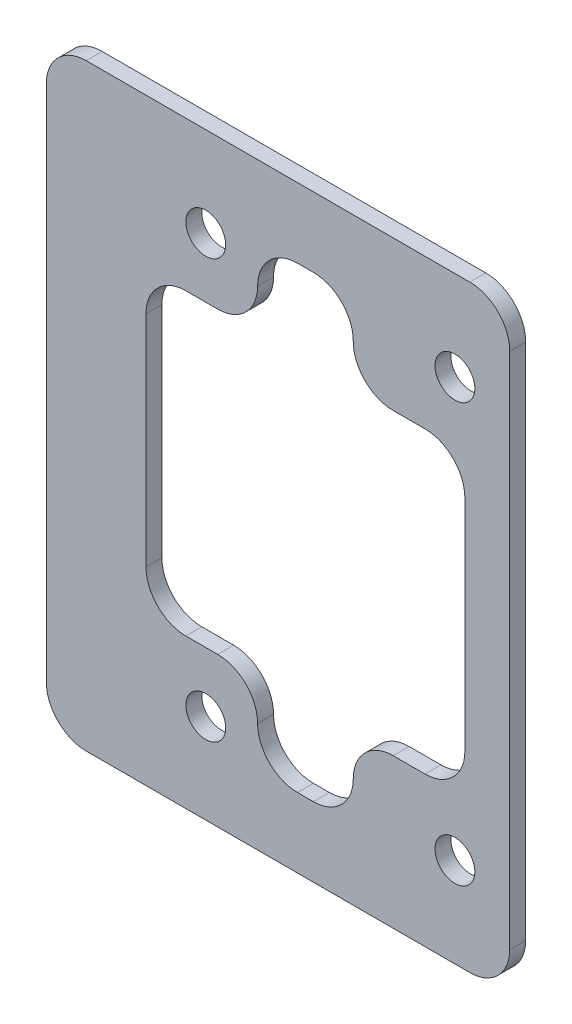
ISO-10303-21;
HEADER;
FILE_DESCRIPTION(('STEP AP214'),'2;1');
FILE_NAME('part.step','',(''),(''),'','','');
FILE_SCHEMA(('AUTOMOTIVE_DESIGN { 1 0 10303 214 1 1 1 1 }'));
ENDSEC;
DATA;
#1=APPLICATION_CONTEXT('core data for automotive mechanical design processes');
#2=APPLICATION_PROTOCOL_DEFINITION('international standard','automotive_design',2000,#1);
#3=PRODUCT_CONTEXT('',#1,'mechanical');
#4=PRODUCT('Part','Part','',(#3));
#5=PRODUCT_RELATED_PRODUCT_CATEGORY('part','',(#4));
#6=PRODUCT_DEFINITION_FORMATION('','',#4);
#7=PRODUCT_DEFINITION_CONTEXT('part definition',#1,'design');
#8=PRODUCT_DEFINITION('design','',#6,#7);
#9=PRODUCT_DEFINITION_SHAPE('','',#8);
#10=(LENGTH_UNIT() NAMED_UNIT(*) SI_UNIT(.MILLI.,.METRE.));
#11=(NAMED_UNIT(*) PLANE_ANGLE_UNIT() SI_UNIT($,.RADIAN.));
#12=(NAMED_UNIT(*) SI_UNIT($,.STERADIAN.) SOLID_ANGLE_UNIT());
#13=UNCERTAINTY_MEASURE_WITH_UNIT(LENGTH_MEASURE(1.E-05),#10,'distance_accuracy_value','');
#14=(GEOMETRIC_REPRESENTATION_CONTEXT(3) GLOBAL_UNCERTAINTY_ASSIGNED_CONTEXT((#13)) GLOBAL_UNIT_ASSIGNED_CONTEXT((#10,
#11,#12)) REPRESENTATION_CONTEXT('',''));
#15=CARTESIAN_POINT('',(0.,0.,0.));
#16=DIRECTION('',(0.,0.,1.));
#17=DIRECTION('',(1.,0.,0.));
#18=AXIS2_PLACEMENT_3D('',#15,#16,#17);
#19=CARTESIAN_POINT('',(0.,0.,0.8));
#20=DIRECTION('',(0.,0.,1.));
#21=DIRECTION('',(1.,0.,0.));
#22=AXIS2_PLACEMENT_3D('',#19,#20,#21);
#23=PLANE('',#22);
#24=DIRECTION('',(1.,0.,0.));
#25=VECTOR('',#24,1.);
#26=CARTESIAN_POINT('',(20.5873581780567,36.,0.8));
#27=LINE('',#26,#25);
#28=CARTESIAN_POINT('',(17.7873581780567,36.,0.8));
#29=VERTEX_POINT('',#28);
#30=CARTESIAN_POINT('',(18.5873581780567,36.,0.8));
#31=VERTEX_POINT('',#30);
#32=EDGE_CURVE('E798',#29,#31,#27,.T.);
#33=ORIENTED_EDGE('',*,*,#32,.T.);
#34=CARTESIAN_POINT('',(18.5873581780567,34.,0.8));
#35=DIRECTION('',(0.,0.,1.));
#36=DIRECTION('',(1.,0.,0.));
#37=AXIS2_PLACEMENT_3D('',#34,#35,#36);
#38=CIRCLE('',#37,2.);
#39=CARTESIAN_POINT('',(20.5873581780567,34.,0.8));
#40=VERTEX_POINT('',#39);
#41=EDGE_CURVE('E52',#31,#40,#38,.F.);
#42=ORIENTED_EDGE('',*,*,#41,.T.);
#43=CARTESIAN_POINT('',(22.5873581780567,34.,0.8));
#44=DIRECTION('',(0.,0.,1.));
#45=DIRECTION('',(1.,0.,0.));
#46=AXIS2_PLACEMENT_3D('',#43,#44,#45);
#47=CIRCLE('',#46,2.);
#48=CARTESIAN_POINT('',(22.5873581780567,32.,0.8));
#49=VERTEX_POINT('',#48);
#50=EDGE_CURVE('E314',#40,#49,#47,.T.);
#51=ORIENTED_EDGE('',*,*,#50,.T.);
#52=DIRECTION('',(1.,0.,0.));
#53=VECTOR('',#52,1.);
#54=CARTESIAN_POINT('',(26.1873581780567,32.,0.8));
#55=LINE('',#54,#53);
#56=CARTESIAN_POINT('',(24.1873581780567,32.,0.8));
#57=VERTEX_POINT('',#56);
#58=EDGE_CURVE('E799',#49,#57,#55,.T.);
#59=ORIENTED_EDGE('',*,*,#58,.T.);
#60=CARTESIAN_POINT('',(24.1873581780567,30.,0.8));
#61=DIRECTION('',(0.,0.,1.));
#62=DIRECTION('',(1.,0.,0.));
#63=AXIS2_PLACEMENT_3D('',#60,#61,#62);
#64=CIRCLE('',#63,2.);
#65=CARTESIAN_POINT('',(26.1873581780567,30.,0.8));
#66=VERTEX_POINT('',#65);
#67=EDGE_CURVE('E347',#57,#66,#64,.F.);
#68=ORIENTED_EDGE('',*,*,#67,.T.);
#69=DIRECTION('',(0.,-1.,0.));
#70=VECTOR('',#69,1.);
#71=CARTESIAN_POINT('',(26.1873581780567,17.,0.8));
#72=LINE('',#71,#70);
#73=CARTESIAN_POINT('',(26.1873581780567,19.,0.8));
#74=VERTEX_POINT('',#73);
#75=EDGE_CURVE('E411',#66,#74,#72,.T.);
#76=ORIENTED_EDGE('',*,*,#75,.T.);
#77=CARTESIAN_POINT('',(24.1873581780567,19.,0.8));
#78=DIRECTION('',(0.,0.,1.));
#79=DIRECTION('',(1.,0.,0.));
#80=AXIS2_PLACEMENT_3D('',#77,#78,#79);
#81=CIRCLE('',#80,2.);
#82=CARTESIAN_POINT('',(24.1873581780567,17.,0.8));
#83=VERTEX_POINT('',#82);
#84=EDGE_CURVE('E11',#74,#83,#81,.F.);
#85=ORIENTED_EDGE('',*,*,#84,.T.);
#86=DIRECTION('',(-1.,0.,0.));
#87=VECTOR('',#86,1.);
#88=CARTESIAN_POINT('',(26.1873581780567,17.,0.8));
#89=LINE('',#88,#87);
#90=CARTESIAN_POINT('',(22.5873581780567,17.,0.8));
#91=VERTEX_POINT('',#90);
#92=EDGE_CURVE('E430',#83,#91,#89,.T.);
#93=ORIENTED_EDGE('',*,*,#92,.T.);
#94=CARTESIAN_POINT('',(22.5873581780567,15.,0.8));
#95=DIRECTION('',(0.,0.,1.));
#96=DIRECTION('',(1.,0.,0.));
#97=AXIS2_PLACEMENT_3D('',#94,#95,#96);
#98=CIRCLE('',#97,2.);
#99=CARTESIAN_POINT('',(20.5873581780567,15.,0.8));
#100=VERTEX_POINT('',#99);
#101=EDGE_CURVE('E308',#91,#100,#98,.T.);
#102=ORIENTED_EDGE('',*,*,#101,.T.);
#103=CARTESIAN_POINT('',(18.5873581780567,15.,0.8));
#104=DIRECTION('',(0.,0.,1.));
#105=DIRECTION('',(1.,0.,0.));
#106=AXIS2_PLACEMENT_3D('',#103,#104,#105);
#107=CIRCLE('',#106,2.);
#108=CARTESIAN_POINT('',(18.5873581780567,13.,0.8));
#109=VERTEX_POINT('',#108);
#110=EDGE_CURVE('E370',#100,#109,#107,.F.);
#111=ORIENTED_EDGE('',*,*,#110,.T.);
#112=DIRECTION('',(-1.,0.,0.));
#113=VECTOR('',#112,1.);
#114=CARTESIAN_POINT('',(20.5873581780567,13.,0.8));
#115=LINE('',#114,#113);
#116=CARTESIAN_POINT('',(17.7873581780567,13.,0.8));
#117=VERTEX_POINT('',#116);
#118=EDGE_CURVE('E784',#109,#117,#115,.T.);
#119=ORIENTED_EDGE('',*,*,#118,.T.);
#120=CARTESIAN_POINT('',(17.7873581780567,15.,0.8));
#121=DIRECTION('',(0.,0.,1.));
#122=DIRECTION('',(1.,0.,0.));
#123=AXIS2_PLACEMENT_3D('',#120,#121,#122);
#124=CIRCLE('',#123,2.);
#125=CARTESIAN_POINT('',(15.7873581780567,15.,0.8));
#126=VERTEX_POINT('',#125);
#127=EDGE_CURVE('E366',#117,#126,#124,.F.);
#128=ORIENTED_EDGE('',*,*,#127,.T.);
#129=CARTESIAN_POINT('',(13.7873581780567,15.,0.8));
#130=DIRECTION('',(0.,0.,1.));
#131=DIRECTION('',(1.,0.,0.));
#132=AXIS2_PLACEMENT_3D('',#129,#130,#131);
#133=CIRCLE('',#132,2.);
#134=CARTESIAN_POINT('',(13.7873581780567,17.,0.8));
#135=VERTEX_POINT('',#134);
#136=EDGE_CURVE('E310',#126,#135,#133,.T.);
#137=ORIENTED_EDGE('',*,*,#136,.T.);
#138=DIRECTION('',(-1.,0.,0.));
#139=VECTOR('',#138,1.);
#140=CARTESIAN_POINT('',(15.7873581780567,17.,0.8));
#141=LINE('',#140,#139);
#142=CARTESIAN_POINT('',(12.1873581780567,17.,0.8));
#143=VERTEX_POINT('',#142);
#144=EDGE_CURVE('E787',#135,#143,#141,.T.);
#145=ORIENTED_EDGE('',*,*,#144,.T.);
#146=CARTESIAN_POINT('',(12.1873581780567,19.,0.8));
#147=DIRECTION('',(0.,0.,1.));
#148=DIRECTION('',(1.,0.,0.));
#149=AXIS2_PLACEMENT_3D('',#146,#147,#148);
#150=CIRCLE('',#149,2.);
#151=CARTESIAN_POINT('',(10.1873581780567,19.,0.8));
#152=VERTEX_POINT('',#151);
#153=EDGE_CURVE('E362',#143,#152,#150,.F.);
#154=ORIENTED_EDGE('',*,*,#153,.T.);
#155=DIRECTION('',(0.,1.,0.));
#156=VECTOR('',#155,1.);
#157=CARTESIAN_POINT('',(10.1873581780567,32.,0.8));
#158=LINE('',#157,#156);
#159=CARTESIAN_POINT('',(10.1873581780567,30.,0.8));
#160=VERTEX_POINT('',#159);
#161=EDGE_CURVE('E792',#152,#160,#158,.T.);
#162=ORIENTED_EDGE('',*,*,#161,.T.);
#163=CARTESIAN_POINT('',(12.1873581780567,30.,0.8));
#164=DIRECTION('',(0.,0.,1.));
#165=DIRECTION('',(1.,0.,0.));
#166=AXIS2_PLACEMENT_3D('',#163,#164,#165);
#167=CIRCLE('',#166,2.);
#168=CARTESIAN_POINT('',(12.1873581780567,32.,0.8));
#169=VERTEX_POINT('',#168);
#170=EDGE_CURVE('E358',#160,#169,#167,.F.);
#171=ORIENTED_EDGE('',*,*,#170,.T.);
#172=DIRECTION('',(1.,0.,0.));
#173=VECTOR('',#172,1.);
#174=CARTESIAN_POINT('',(15.7873581780567,32.,0.8));
#175=LINE('',#174,#173);
#176=CARTESIAN_POINT('',(13.7873581780567,32.,0.8));
#177=VERTEX_POINT('',#176);
#178=EDGE_CURVE('E795',#169,#177,#175,.T.);
#179=ORIENTED_EDGE('',*,*,#178,.T.);
#180=CARTESIAN_POINT('',(13.7873581780567,34.,0.8));
#181=DIRECTION('',(0.,0.,1.));
#182=DIRECTION('',(1.,0.,0.));
#183=AXIS2_PLACEMENT_3D('',#180,#181,#182);
#184=CIRCLE('',#183,2.);
#185=CARTESIAN_POINT('',(15.7873581780567,34.,0.8));
#186=VERTEX_POINT('',#185);
#187=EDGE_CURVE('E312',#177,#186,#184,.T.);
#188=ORIENTED_EDGE('',*,*,#187,.T.);
#189=CARTESIAN_POINT('',(17.7873581780567,34.,0.8));
#190=DIRECTION('',(0.,0.,1.));
#191=DIRECTION('',(1.,0.,0.));
#192=AXIS2_PLACEMENT_3D('',#189,#190,#191);
#193=CIRCLE('',#192,2.);
#194=EDGE_CURVE('E354',#186,#29,#193,.F.);
#195=ORIENTED_EDGE('',*,*,#194,.T.);
#196=EDGE_LOOP('',(#33,#42,#51,#59,#68,#76,#85,#93,#102,#111,#119,#128,#137,#145,#154,#162,#171,
#179,#188,#195));
#197=FACE_BOUND('',#196,.T.);
#198=CARTESIAN_POINT('',(13.1873581780567,35.,0.8));
#199=DIRECTION('',(0.,0.,1.));
#200=DIRECTION('',(1.,0.,0.));
#201=AXIS2_PLACEMENT_3D('',#198,#199,#200);
#202=CIRCLE('',#201,1.);
#203=CARTESIAN_POINT('',(14.1873581780567,35.,0.8));
#204=VERTEX_POINT('',#203);
#205=EDGE_CURVE('E438',#204,#204,#202,.T.);
#206=ORIENTED_EDGE('',*,*,#205,.F.);
#207=EDGE_LOOP('',(#206));
#208=FACE_BOUND('',#207,.T.);
#209=CARTESIAN_POINT('',(25.6873581780567,35.,0.8));
#210=DIRECTION('',(0.,0.,1.));
#211=DIRECTION('',(-1.,0.,0.));
#212=AXIS2_PLACEMENT_3D('',#209,#210,#211);
#213=CIRCLE('',#212,1.00000000000001);
#214=CARTESIAN_POINT('',(24.6873581780567,35.,0.8));
#215=VERTEX_POINT('',#214);
#216=EDGE_CURVE('E256',#215,#215,#213,.T.);
#217=ORIENTED_EDGE('',*,*,#216,.F.);
#218=EDGE_LOOP('',(#217));
#219=FACE_BOUND('',#218,.T.);
#220=DIRECTION('',(0.,-1.,0.));
#221=VECTOR('',#220,1.);
#222=CARTESIAN_POINT('',(5.18735817805674,39.5,0.8));
#223=LINE('',#222,#221);
#224=CARTESIAN_POINT('',(5.18735817805674,37.5,0.8));
#225=VERTEX_POINT('',#224);
#226=CARTESIAN_POINT('',(5.18735817805675,11.5,0.8));
#227=VERTEX_POINT('',#226);
#228=EDGE_CURVE('E262',#225,#227,#223,.T.);
#229=ORIENTED_EDGE('',*,*,#228,.T.);
#230=CARTESIAN_POINT('',(7.18735817805675,11.5,0.8));
#231=DIRECTION('',(0.,0.,1.));
#232=DIRECTION('',(1.,0.,0.));
#233=AXIS2_PLACEMENT_3D('',#230,#231,#232);
#234=CIRCLE('',#233,2.);
#235=CARTESIAN_POINT('',(7.18735817805675,9.5,0.8));
#236=VERTEX_POINT('',#235);
#237=EDGE_CURVE('E278',#227,#236,#234,.T.);
#238=ORIENTED_EDGE('',*,*,#237,.T.);
#239=DIRECTION('',(1.,0.,0.));
#240=VECTOR('',#239,1.);
#241=CARTESIAN_POINT('',(5.18735817805675,9.5,0.8));
#242=LINE('',#241,#240);
#243=CARTESIAN_POINT('',(26.4373581780567,9.5,0.8));
#244=VERTEX_POINT('',#243);
#245=EDGE_CURVE('E243',#236,#244,#242,.T.);
#246=ORIENTED_EDGE('',*,*,#245,.T.);
#247=CARTESIAN_POINT('',(26.4373581780567,11.5,0.8));
#248=DIRECTION('',(0.,0.,1.));
#249=DIRECTION('',(1.,0.,0.));
#250=AXIS2_PLACEMENT_3D('',#247,#248,#249);
#251=CIRCLE('',#250,2.);
#252=CARTESIAN_POINT('',(28.4373581780567,11.5,0.8));
#253=VERTEX_POINT('',#252);
#254=EDGE_CURVE('E276',#244,#253,#251,.T.);
#255=ORIENTED_EDGE('',*,*,#254,.T.);
#256=DIRECTION('',(0.,1.,0.));
#257=VECTOR('',#256,1.);
#258=CARTESIAN_POINT('',(28.4373581780567,39.5,0.8));
#259=LINE('',#258,#257);
#260=CARTESIAN_POINT('',(28.4373581780567,37.5,0.8));
#261=VERTEX_POINT('',#260);
#262=EDGE_CURVE('E457',#253,#261,#259,.T.);
#263=ORIENTED_EDGE('',*,*,#262,.T.);
#264=CARTESIAN_POINT('',(26.4373581780567,37.5,0.8));
#265=DIRECTION('',(0.,0.,1.));
#266=DIRECTION('',(1.,0.,0.));
#267=AXIS2_PLACEMENT_3D('',#264,#265,#266);
#268=CIRCLE('',#267,2.);
#269=CARTESIAN_POINT('',(26.4373581780567,39.5,0.8));
#270=VERTEX_POINT('',#269);
#271=EDGE_CURVE('E272',#261,#270,#268,.T.);
#272=ORIENTED_EDGE('',*,*,#271,.T.);
#273=DIRECTION('',(-1.,0.,0.));
#274=VECTOR('',#273,1.);
#275=CARTESIAN_POINT('',(5.18735817805674,39.5,0.8));
#276=LINE('',#275,#274);
#277=CARTESIAN_POINT('',(7.18735817805674,39.5,0.8));
#278=VERTEX_POINT('',#277);
#279=EDGE_CURVE('E263',#270,#278,#276,.T.);
#280=ORIENTED_EDGE('',*,*,#279,.T.);
#281=CARTESIAN_POINT('',(7.18735817805674,37.5,0.8));
#282=DIRECTION('',(0.,0.,1.));
#283=DIRECTION('',(1.,0.,0.));
#284=AXIS2_PLACEMENT_3D('',#281,#282,#283);
#285=CIRCLE('',#284,2.);
#286=EDGE_CURVE('E274',#278,#225,#285,.T.);
#287=ORIENTED_EDGE('',*,*,#286,.T.);
#288=EDGE_LOOP('',(#229,#238,#246,#255,#263,#272,#280,#287));
#289=FACE_BOUND('',#288,.T.);
#290=CARTESIAN_POINT('',(13.1873581780567,14.,0.8));
#291=DIRECTION('',(0.,0.,1.));
#292=DIRECTION('',(-1.,0.,0.));
#293=AXIS2_PLACEMENT_3D('',#290,#291,#292);
#294=CIRCLE('',#293,1.);
#295=CARTESIAN_POINT('',(12.1873581780567,14.,0.8));
#296=VERTEX_POINT('',#295);
#297=EDGE_CURVE('E444',#296,#296,#294,.T.);
#298=ORIENTED_EDGE('',*,*,#297,.F.);
#299=EDGE_LOOP('',(#298));
#300=FACE_BOUND('',#299,.T.);
#301=CARTESIAN_POINT('',(25.6873581780568,14.,0.8));
#302=DIRECTION('',(0.,0.,1.));
#303=DIRECTION('',(1.,0.,0.));
#304=AXIS2_PLACEMENT_3D('',#301,#302,#303);
#305=CIRCLE('',#304,1.);
#306=CARTESIAN_POINT('',(26.6873581780568,14.,0.8));
#307=VERTEX_POINT('',#306);
#308=EDGE_CURVE('E431',#307,#307,#305,.T.);
#309=ORIENTED_EDGE('',*,*,#308,.F.);
#310=EDGE_LOOP('',(#309));
#311=FACE_BOUND('',#310,.T.);
#312=ADVANCED_FACE('F35',(#197,#208,#219,#289,#300,#311),#23,.T.);
#313=CARTESIAN_POINT('',(0.,0.,0.));
#314=DIRECTION('',(0.,0.,1.));
#315=DIRECTION('',(1.,0.,0.));
#316=AXIS2_PLACEMENT_3D('',#313,#314,#315);
#317=PLANE('',#316);
#318=DIRECTION('',(1.,0.,0.));
#319=VECTOR('',#318,1.);
#320=CARTESIAN_POINT('',(26.1873581780567,32.,0.));
#321=LINE('',#320,#319);
#322=CARTESIAN_POINT('',(22.5873581780567,32.,0.));
#323=VERTEX_POINT('',#322);
#324=CARTESIAN_POINT('',(24.1873581780567,32.,0.));
#325=VERTEX_POINT('',#324);
#326=EDGE_CURVE('E424',#323,#325,#321,.T.);
#327=ORIENTED_EDGE('',*,*,#326,.F.);
#328=CARTESIAN_POINT('',(22.5873581780567,34.,0.));
#329=DIRECTION('',(0.,0.,1.));
#330=DIRECTION('',(1.,0.,0.));
#331=AXIS2_PLACEMENT_3D('',#328,#329,#330);
#332=CIRCLE('',#331,2.);
#333=CARTESIAN_POINT('',(20.5873581780567,34.,0.));
#334=VERTEX_POINT('',#333);
#335=EDGE_CURVE('E306',#323,#334,#332,.F.);
#336=ORIENTED_EDGE('',*,*,#335,.T.);
#337=CARTESIAN_POINT('',(18.5873581780567,34.,0.));
#338=DIRECTION('',(0.,0.,1.));
#339=DIRECTION('',(1.,0.,0.));
#340=AXIS2_PLACEMENT_3D('',#337,#338,#339);
#341=CIRCLE('',#340,2.);
#342=CARTESIAN_POINT('',(18.5873581780567,36.,0.));
#343=VERTEX_POINT('',#342);
#344=EDGE_CURVE('E349',#334,#343,#341,.T.);
#345=ORIENTED_EDGE('',*,*,#344,.T.);
#346=DIRECTION('',(1.,0.,0.));
#347=VECTOR('',#346,1.);
#348=CARTESIAN_POINT('',(20.5873581780567,36.,0.));
#349=LINE('',#348,#347);
#350=CARTESIAN_POINT('',(17.7873581780567,36.,0.));
#351=VERTEX_POINT('',#350);
#352=EDGE_CURVE('E422',#351,#343,#349,.T.);
#353=ORIENTED_EDGE('',*,*,#352,.F.);
#354=CARTESIAN_POINT('',(17.7873581780567,34.,0.));
#355=DIRECTION('',(0.,0.,1.));
#356=DIRECTION('',(1.,0.,0.));
#357=AXIS2_PLACEMENT_3D('',#354,#355,#356);
#358=CIRCLE('',#357,2.);
#359=CARTESIAN_POINT('',(15.7873581780567,34.,0.));
#360=VERTEX_POINT('',#359);
#361=EDGE_CURVE('E352',#351,#360,#358,.T.);
#362=ORIENTED_EDGE('',*,*,#361,.T.);
#363=CARTESIAN_POINT('',(13.7873581780567,34.,0.));
#364=DIRECTION('',(0.,0.,1.));
#365=DIRECTION('',(1.,0.,0.));
#366=AXIS2_PLACEMENT_3D('',#363,#364,#365);
#367=CIRCLE('',#366,2.);
#368=CARTESIAN_POINT('',(13.7873581780567,32.,0.));
#369=VERTEX_POINT('',#368);
#370=EDGE_CURVE('E304',#360,#369,#367,.F.);
#371=ORIENTED_EDGE('',*,*,#370,.T.);
#372=DIRECTION('',(1.,0.,0.));
#373=VECTOR('',#372,1.);
#374=CARTESIAN_POINT('',(15.7873581780567,32.,0.));
#375=LINE('',#374,#373);
#376=CARTESIAN_POINT('',(12.1873581780567,32.,0.));
#377=VERTEX_POINT('',#376);
#378=EDGE_CURVE('E419',#377,#369,#375,.T.);
#379=ORIENTED_EDGE('',*,*,#378,.F.);
#380=CARTESIAN_POINT('',(12.1873581780567,30.,0.));
#381=DIRECTION('',(0.,0.,1.));
#382=DIRECTION('',(1.,0.,0.));
#383=AXIS2_PLACEMENT_3D('',#380,#381,#382);
#384=CIRCLE('',#383,2.);
#385=CARTESIAN_POINT('',(10.1873581780567,30.,0.));
#386=VERTEX_POINT('',#385);
#387=EDGE_CURVE('E356',#377,#386,#384,.T.);
#388=ORIENTED_EDGE('',*,*,#387,.T.);
#389=DIRECTION('',(0.,1.,0.));
#390=VECTOR('',#389,1.);
#391=CARTESIAN_POINT('',(10.1873581780567,32.,0.));
#392=LINE('',#391,#390);
#393=CARTESIAN_POINT('',(10.1873581780567,19.,0.));
#394=VERTEX_POINT('',#393);
#395=EDGE_CURVE('E416',#394,#386,#392,.T.);
#396=ORIENTED_EDGE('',*,*,#395,.F.);
#397=CARTESIAN_POINT('',(12.1873581780567,19.,0.));
#398=DIRECTION('',(0.,0.,1.));
#399=DIRECTION('',(1.,0.,0.));
#400=AXIS2_PLACEMENT_3D('',#397,#398,#399);
#401=CIRCLE('',#400,2.);
#402=CARTESIAN_POINT('',(12.1873581780567,17.,0.));
#403=VERTEX_POINT('',#402);
#404=EDGE_CURVE('E360',#394,#403,#401,.T.);
#405=ORIENTED_EDGE('',*,*,#404,.T.);
#406=DIRECTION('',(-1.,0.,0.));
#407=VECTOR('',#406,1.);
#408=CARTESIAN_POINT('',(15.7873581780567,17.,0.));
#409=LINE('',#408,#407);
#410=CARTESIAN_POINT('',(13.7873581780567,17.,0.));
#411=VERTEX_POINT('',#410);
#412=EDGE_CURVE('E408',#411,#403,#409,.T.);
#413=ORIENTED_EDGE('',*,*,#412,.F.);
#414=CARTESIAN_POINT('',(13.7873581780567,15.,0.));
#415=DIRECTION('',(0.,0.,1.));
#416=DIRECTION('',(1.,0.,0.));
#417=AXIS2_PLACEMENT_3D('',#414,#415,#416);
#418=CIRCLE('',#417,2.);
#419=CARTESIAN_POINT('',(15.7873581780567,15.,0.));
#420=VERTEX_POINT('',#419);
#421=EDGE_CURVE('E302',#411,#420,#418,.F.);
#422=ORIENTED_EDGE('',*,*,#421,.T.);
#423=CARTESIAN_POINT('',(17.7873581780567,15.,0.));
#424=DIRECTION('',(0.,0.,1.));
#425=DIRECTION('',(1.,0.,0.));
#426=AXIS2_PLACEMENT_3D('',#423,#424,#425);
#427=CIRCLE('',#426,2.);
#428=CARTESIAN_POINT('',(17.7873581780567,13.,0.));
#429=VERTEX_POINT('',#428);
#430=EDGE_CURVE('E364',#420,#429,#427,.T.);
#431=ORIENTED_EDGE('',*,*,#430,.T.);
#432=DIRECTION('',(-1.,0.,0.));
#433=VECTOR('',#432,1.);
#434=CARTESIAN_POINT('',(20.5873581780567,13.,0.));
#435=LINE('',#434,#433);
#436=CARTESIAN_POINT('',(18.5873581780567,13.,0.));
#437=VERTEX_POINT('',#436);
#438=EDGE_CURVE('E405',#437,#429,#435,.T.);
#439=ORIENTED_EDGE('',*,*,#438,.F.);
#440=CARTESIAN_POINT('',(18.5873581780567,15.,0.));
#441=DIRECTION('',(0.,0.,1.));
#442=DIRECTION('',(1.,0.,0.));
#443=AXIS2_PLACEMENT_3D('',#440,#441,#442);
#444=CIRCLE('',#443,2.);
#445=CARTESIAN_POINT('',(20.5873581780567,15.,0.));
#446=VERTEX_POINT('',#445);
#447=EDGE_CURVE('E368',#437,#446,#444,.T.);
#448=ORIENTED_EDGE('',*,*,#447,.T.);
#449=CARTESIAN_POINT('',(22.5873581780567,15.,0.));
#450=DIRECTION('',(0.,0.,1.));
#451=DIRECTION('',(1.,0.,0.));
#452=AXIS2_PLACEMENT_3D('',#449,#450,#451);
#453=CIRCLE('',#452,2.);
#454=CARTESIAN_POINT('',(22.5873581780567,17.,0.));
#455=VERTEX_POINT('',#454);
#456=EDGE_CURVE('E300',#446,#455,#453,.F.);
#457=ORIENTED_EDGE('',*,*,#456,.T.);
#458=DIRECTION('',(-1.,0.,0.));
#459=VECTOR('',#458,1.);
#460=CARTESIAN_POINT('',(26.1873581780567,17.,0.));
#461=LINE('',#460,#459);
#462=CARTESIAN_POINT('',(24.1873581780567,17.,0.));
#463=VERTEX_POINT('',#462);
#464=EDGE_CURVE('E376',#463,#455,#461,.T.);
#465=ORIENTED_EDGE('',*,*,#464,.F.);
#466=CARTESIAN_POINT('',(24.1873581780567,19.,0.));
#467=DIRECTION('',(0.,0.,1.));
#468=DIRECTION('',(1.,0.,0.));
#469=AXIS2_PLACEMENT_3D('',#466,#467,#468);
#470=CIRCLE('',#469,2.);
#471=CARTESIAN_POINT('',(26.1873581780567,19.,0.));
#472=VERTEX_POINT('',#471);
#473=EDGE_CURVE('E44',#463,#472,#470,.T.);
#474=ORIENTED_EDGE('',*,*,#473,.T.);
#475=DIRECTION('',(0.,-1.,0.));
#476=VECTOR('',#475,1.);
#477=CARTESIAN_POINT('',(26.1873581780567,17.,0.));
#478=LINE('',#477,#476);
#479=CARTESIAN_POINT('',(26.1873581780567,30.,0.));
#480=VERTEX_POINT('',#479);
#481=EDGE_CURVE('E427',#480,#472,#478,.T.);
#482=ORIENTED_EDGE('',*,*,#481,.F.);
#483=CARTESIAN_POINT('',(24.1873581780567,30.,0.));
#484=DIRECTION('',(0.,0.,1.));
#485=DIRECTION('',(1.,0.,0.));
#486=AXIS2_PLACEMENT_3D('',#483,#484,#485);
#487=CIRCLE('',#486,2.);
#488=EDGE_CURVE('E345',#480,#325,#487,.T.);
#489=ORIENTED_EDGE('',*,*,#488,.T.);
#490=EDGE_LOOP('',(#327,#336,#345,#353,#362,#371,#379,#388,#396,#405,#413,#422,#431,#439,#448,
#457,#465,#474,#482,#489));
#491=FACE_BOUND('',#490,.T.);
#492=DIRECTION('',(1.,0.,0.));
#493=VECTOR('',#492,1.);
#494=CARTESIAN_POINT('',(5.18735817805675,9.5,0.));
#495=LINE('',#494,#493);
#496=CARTESIAN_POINT('',(7.18735817805675,9.5,0.));
#497=VERTEX_POINT('',#496);
#498=CARTESIAN_POINT('',(26.4373581780567,9.5,0.));
#499=VERTEX_POINT('',#498);
#500=EDGE_CURVE('E240',#497,#499,#495,.T.);
#501=ORIENTED_EDGE('',*,*,#500,.F.);
#502=CARTESIAN_POINT('',(7.18735817805675,11.5,0.));
#503=DIRECTION('',(0.,0.,1.));
#504=DIRECTION('',(1.,0.,0.));
#505=AXIS2_PLACEMENT_3D('',#502,#503,#504);
#506=CIRCLE('',#505,2.);
#507=CARTESIAN_POINT('',(5.18735817805675,11.5,0.));
#508=VERTEX_POINT('',#507);
#509=EDGE_CURVE('E223',#497,#508,#506,.F.);
#510=ORIENTED_EDGE('',*,*,#509,.T.);
#511=DIRECTION('',(0.,-1.,0.));
#512=VECTOR('',#511,1.);
#513=CARTESIAN_POINT('',(5.18735817805674,39.5,0.));
#514=LINE('',#513,#512);
#515=CARTESIAN_POINT('',(5.18735817805674,37.5,0.));
#516=VERTEX_POINT('',#515);
#517=EDGE_CURVE('E251',#516,#508,#514,.T.);
#518=ORIENTED_EDGE('',*,*,#517,.F.);
#519=CARTESIAN_POINT('',(7.18735817805674,37.5,0.));
#520=DIRECTION('',(0.,0.,1.));
#521=DIRECTION('',(1.,0.,0.));
#522=AXIS2_PLACEMENT_3D('',#519,#520,#521);
#523=CIRCLE('',#522,2.);
#524=CARTESIAN_POINT('',(7.18735817805674,39.5,0.));
#525=VERTEX_POINT('',#524);
#526=EDGE_CURVE('E266',#516,#525,#523,.F.);
#527=ORIENTED_EDGE('',*,*,#526,.T.);
#528=DIRECTION('',(-1.,0.,0.));
#529=VECTOR('',#528,1.);
#530=CARTESIAN_POINT('',(5.18735817805674,39.5,0.));
#531=LINE('',#530,#529);
#532=CARTESIAN_POINT('',(26.4373581780567,39.5,0.));
#533=VERTEX_POINT('',#532);
#534=EDGE_CURVE('E254',#533,#525,#531,.T.);
#535=ORIENTED_EDGE('',*,*,#534,.F.);
#536=CARTESIAN_POINT('',(26.4373581780567,37.5,0.));
#537=DIRECTION('',(0.,0.,1.));
#538=DIRECTION('',(1.,0.,0.));
#539=AXIS2_PLACEMENT_3D('',#536,#537,#538);
#540=CIRCLE('',#539,2.);
#541=CARTESIAN_POINT('',(28.4373581780567,37.5,0.));
#542=VERTEX_POINT('',#541);
#543=EDGE_CURVE('E244',#533,#542,#540,.F.);
#544=ORIENTED_EDGE('',*,*,#543,.T.);
#545=DIRECTION('',(0.,1.,0.));
#546=VECTOR('',#545,1.);
#547=CARTESIAN_POINT('',(28.4373581780567,39.5,0.));
#548=LINE('',#547,#546);
#549=CARTESIAN_POINT('',(28.4373581780567,11.5,0.));
#550=VERTEX_POINT('',#549);
#551=EDGE_CURVE('E250',#550,#542,#548,.T.);
#552=ORIENTED_EDGE('',*,*,#551,.F.);
#553=CARTESIAN_POINT('',(26.4373581780567,11.5,0.));
#554=DIRECTION('',(0.,0.,1.));
#555=DIRECTION('',(1.,0.,0.));
#556=AXIS2_PLACEMENT_3D('',#553,#554,#555);
#557=CIRCLE('',#556,2.);
#558=EDGE_CURVE('E234',#550,#499,#557,.F.);
#559=ORIENTED_EDGE('',*,*,#558,.T.);
#560=EDGE_LOOP('',(#501,#510,#518,#527,#535,#544,#552,#559));
#561=FACE_BOUND('',#560,.T.);
#562=CARTESIAN_POINT('',(25.6873581780567,35.,0.));
#563=DIRECTION('',(0.,0.,1.));
#564=DIRECTION('',(-1.,0.,0.));
#565=AXIS2_PLACEMENT_3D('',#562,#563,#564);
#566=CIRCLE('',#565,1.00000000000001);
#567=CARTESIAN_POINT('',(24.6873581780567,35.,0.));
#568=VERTEX_POINT('',#567);
#569=EDGE_CURVE('E447',#568,#568,#566,.T.);
#570=ORIENTED_EDGE('',*,*,#569,.T.);
#571=EDGE_LOOP('',(#570));
#572=FACE_BOUND('',#571,.T.);
#573=CARTESIAN_POINT('',(13.1873581780567,14.,0.));
#574=DIRECTION('',(0.,0.,1.));
#575=DIRECTION('',(-1.,0.,0.));
#576=AXIS2_PLACEMENT_3D('',#573,#574,#575);
#577=CIRCLE('',#576,1.);
#578=CARTESIAN_POINT('',(12.1873581780567,14.,0.));
#579=VERTEX_POINT('',#578);
#580=EDGE_CURVE('E441',#579,#579,#577,.T.);
#581=ORIENTED_EDGE('',*,*,#580,.T.);
#582=EDGE_LOOP('',(#581));
#583=FACE_BOUND('',#582,.T.);
#584=CARTESIAN_POINT('',(13.1873581780567,35.,0.));
#585=DIRECTION('',(0.,0.,1.));
#586=DIRECTION('',(1.,0.,0.));
#587=AXIS2_PLACEMENT_3D('',#584,#585,#586);
#588=CIRCLE('',#587,1.);
#589=CARTESIAN_POINT('',(14.1873581780567,35.,0.));
#590=VERTEX_POINT('',#589);
#591=EDGE_CURVE('E434',#590,#590,#588,.T.);
#592=ORIENTED_EDGE('',*,*,#591,.T.);
#593=EDGE_LOOP('',(#592));
#594=FACE_BOUND('',#593,.T.);
#595=CARTESIAN_POINT('',(25.6873581780568,14.,0.));
#596=DIRECTION('',(0.,0.,1.));
#597=DIRECTION('',(1.,0.,0.));
#598=AXIS2_PLACEMENT_3D('',#595,#596,#597);
#599=CIRCLE('',#598,1.);
#600=CARTESIAN_POINT('',(26.6873581780568,14.,0.));
#601=VERTEX_POINT('',#600);
#602=EDGE_CURVE('E435',#601,#601,#599,.T.);
#603=ORIENTED_EDGE('',*,*,#602,.T.);
#604=EDGE_LOOP('',(#603));
#605=FACE_BOUND('',#604,.T.);
#606=ADVANCED_FACE('F247',(#491,#561,#572,#583,#594,#605),#317,.F.);
#607=CARTESIAN_POINT('',(5.18735817805674,39.5,0.8));
#608=DIRECTION('',(1.,0.,0.));
#609=DIRECTION('',(0.,1.,0.));
#610=AXIS2_PLACEMENT_3D('',#607,#608,#609);
#611=PLANE('',#610);
#612=ORIENTED_EDGE('',*,*,#517,.T.);
#613=DIRECTION('',(0.,0.,-1.));
#614=VECTOR('',#613,1.);
#615=CARTESIAN_POINT('',(5.18735817805675,11.5,0.8));
#616=LINE('',#615,#614);
#617=EDGE_CURVE('E228',#508,#227,#616,.F.);
#618=ORIENTED_EDGE('',*,*,#617,.T.);
#619=ORIENTED_EDGE('',*,*,#228,.F.);
#620=DIRECTION('',(0.,0.,-1.));
#621=VECTOR('',#620,1.);
#622=CARTESIAN_POINT('',(5.18735817805674,37.5,0.8));
#623=LINE('',#622,#621);
#624=EDGE_CURVE('E233',#225,#516,#623,.T.);
#625=ORIENTED_EDGE('',*,*,#624,.T.);
#626=EDGE_LOOP('',(#612,#618,#619,#625));
#627=FACE_BOUND('',#626,.T.);
#628=ADVANCED_FACE('F473',(#627),#611,.F.);
#629=CARTESIAN_POINT('',(5.18735817805675,9.5,0.8));
#630=DIRECTION('',(0.,1.,0.));
#631=DIRECTION('',(0.,0.,1.));
#632=AXIS2_PLACEMENT_3D('',#629,#630,#631);
#633=PLANE('',#632);
#634=ORIENTED_EDGE('',*,*,#245,.F.);
#635=DIRECTION('',(0.,0.,-1.));
#636=VECTOR('',#635,1.);
#637=CARTESIAN_POINT('',(7.18735817805675,9.5,0.8));
#638=LINE('',#637,#636);
#639=EDGE_CURVE('E227',#236,#497,#638,.T.);
#640=ORIENTED_EDGE('',*,*,#639,.T.);
#641=ORIENTED_EDGE('',*,*,#500,.T.);
#642=DIRECTION('',(0.,0.,-1.));
#643=VECTOR('',#642,1.);
#644=CARTESIAN_POINT('',(26.4373581780567,9.5,0.8));
#645=LINE('',#644,#643);
#646=EDGE_CURVE('E245',#499,#244,#645,.F.);
#647=ORIENTED_EDGE('',*,*,#646,.T.);
#648=EDGE_LOOP('',(#634,#640,#641,#647));
#649=FACE_BOUND('',#648,.T.);
#650=ADVANCED_FACE('F239',(#649),#633,.F.);
#651=CARTESIAN_POINT('',(28.4373581780567,39.5,0.8));
#652=DIRECTION('',(-1.,0.,0.));
#653=DIRECTION('',(0.,-1.,0.));
#654=AXIS2_PLACEMENT_3D('',#651,#652,#653);
#655=PLANE('',#654);
#656=ORIENTED_EDGE('',*,*,#262,.F.);
#657=DIRECTION('',(0.,0.,-1.));
#658=VECTOR('',#657,1.);
#659=CARTESIAN_POINT('',(28.4373581780567,11.5,0.8));
#660=LINE('',#659,#658);
#661=EDGE_CURVE('E282',#253,#550,#660,.T.);
#662=ORIENTED_EDGE('',*,*,#661,.T.);
#663=ORIENTED_EDGE('',*,*,#551,.T.);
#664=DIRECTION('',(0.,0.,-1.));
#665=VECTOR('',#664,1.);
#666=CARTESIAN_POINT('',(28.4373581780567,37.5,0.8));
#667=LINE('',#666,#665);
#668=EDGE_CURVE('E280',#542,#261,#667,.F.);
#669=ORIENTED_EDGE('',*,*,#668,.T.);
#670=EDGE_LOOP('',(#656,#662,#663,#669));
#671=FACE_BOUND('',#670,.T.);
#672=ADVANCED_FACE('F481',(#671),#655,.F.);
#673=CARTESIAN_POINT('',(5.18735817805674,39.5,0.8));
#674=DIRECTION('',(0.,-1.,0.));
#675=DIRECTION('',(1.,0.,0.));
#676=AXIS2_PLACEMENT_3D('',#673,#674,#675);
#677=PLANE('',#676);
#678=ORIENTED_EDGE('',*,*,#534,.T.);
#679=DIRECTION('',(0.,0.,-1.));
#680=VECTOR('',#679,1.);
#681=CARTESIAN_POINT('',(7.18735817805674,39.5,0.8));
#682=LINE('',#681,#680);
#683=EDGE_CURVE('E288',#525,#278,#682,.F.);
#684=ORIENTED_EDGE('',*,*,#683,.T.);
#685=ORIENTED_EDGE('',*,*,#279,.F.);
#686=DIRECTION('',(0.,0.,-1.));
#687=VECTOR('',#686,1.);
#688=CARTESIAN_POINT('',(26.4373581780567,39.5,0.8));
#689=LINE('',#688,#687);
#690=EDGE_CURVE('E285',#270,#533,#689,.T.);
#691=ORIENTED_EDGE('',*,*,#690,.T.);
#692=EDGE_LOOP('',(#678,#684,#685,#691));
#693=FACE_BOUND('',#692,.T.);
#694=ADVANCED_FACE('F475',(#693),#677,.F.);
#695=CARTESIAN_POINT('',(25.6873581780567,35.,0.8));
#696=DIRECTION('',(0.,0.,-1.));
#697=DIRECTION('',(-1.,0.,0.));
#698=AXIS2_PLACEMENT_3D('',#695,#696,#697);
#699=CYLINDRICAL_SURFACE('',#698,1.00000000000001);
#700=ORIENTED_EDGE('',*,*,#216,.T.);
#701=EDGE_LOOP('',(#700));
#702=FACE_BOUND('',#701,.T.);
#703=ORIENTED_EDGE('',*,*,#569,.F.);
#704=EDGE_LOOP('',(#703));
#705=FACE_BOUND('',#704,.T.);
#706=ADVANCED_FACE('F503',(#702,#705),#699,.F.);
#707=CARTESIAN_POINT('',(13.1873581780567,14.,0.8));
#708=DIRECTION('',(0.,0.,-1.));
#709=DIRECTION('',(-1.,0.,0.));
#710=AXIS2_PLACEMENT_3D('',#707,#708,#709);
#711=CYLINDRICAL_SURFACE('',#710,1.);
#712=ORIENTED_EDGE('',*,*,#297,.T.);
#713=EDGE_LOOP('',(#712));
#714=FACE_BOUND('',#713,.T.);
#715=ORIENTED_EDGE('',*,*,#580,.F.);
#716=EDGE_LOOP('',(#715));
#717=FACE_BOUND('',#716,.T.);
#718=ADVANCED_FACE('F537',(#714,#717),#711,.F.);
#719=CARTESIAN_POINT('',(13.1873581780567,35.,0.8));
#720=DIRECTION('',(0.,0.,-1.));
#721=DIRECTION('',(-1.,0.,0.));
#722=AXIS2_PLACEMENT_3D('',#719,#720,#721);
#723=CYLINDRICAL_SURFACE('',#722,1.);
#724=ORIENTED_EDGE('',*,*,#205,.T.);
#725=EDGE_LOOP('',(#724));
#726=FACE_BOUND('',#725,.T.);
#727=ORIENTED_EDGE('',*,*,#591,.F.);
#728=EDGE_LOOP('',(#727));
#729=FACE_BOUND('',#728,.T.);
#730=ADVANCED_FACE('F544',(#726,#729),#723,.F.);
#731=CARTESIAN_POINT('',(25.6873581780568,14.,0.8));
#732=DIRECTION('',(0.,0.,-1.));
#733=DIRECTION('',(-1.,0.,0.));
#734=AXIS2_PLACEMENT_3D('',#731,#732,#733);
#735=CYLINDRICAL_SURFACE('',#734,1.);
#736=ORIENTED_EDGE('',*,*,#308,.T.);
#737=EDGE_LOOP('',(#736));
#738=FACE_BOUND('',#737,.T.);
#739=ORIENTED_EDGE('',*,*,#602,.F.);
#740=EDGE_LOOP('',(#739));
#741=FACE_BOUND('',#740,.T.);
#742=ADVANCED_FACE('F493',(#738,#741),#735,.F.);
#743=CARTESIAN_POINT('',(7.18735817805675,11.5,0.8));
#744=DIRECTION('',(0.,0.,-1.));
#745=DIRECTION('',(-1.,0.,0.));
#746=AXIS2_PLACEMENT_3D('',#743,#744,#745);
#747=CYLINDRICAL_SURFACE('',#746,2.);
#748=ORIENTED_EDGE('',*,*,#237,.F.);
#749=ORIENTED_EDGE('',*,*,#617,.F.);
#750=ORIENTED_EDGE('',*,*,#509,.F.);
#751=ORIENTED_EDGE('',*,*,#639,.F.);
#752=EDGE_LOOP('',(#748,#749,#750,#751));
#753=FACE_BOUND('',#752,.T.);
#754=ADVANCED_FACE('F226',(#753),#747,.T.);
#755=CARTESIAN_POINT('',(26.4373581780567,11.5,0.8));
#756=DIRECTION('',(0.,0.,-1.));
#757=DIRECTION('',(-1.,0.,0.));
#758=AXIS2_PLACEMENT_3D('',#755,#756,#757);
#759=CYLINDRICAL_SURFACE('',#758,2.);
#760=ORIENTED_EDGE('',*,*,#254,.F.);
#761=ORIENTED_EDGE('',*,*,#646,.F.);
#762=ORIENTED_EDGE('',*,*,#558,.F.);
#763=ORIENTED_EDGE('',*,*,#661,.F.);
#764=EDGE_LOOP('',(#760,#761,#762,#763));
#765=FACE_BOUND('',#764,.T.);
#766=ADVANCED_FACE('F485',(#765),#759,.T.);
#767=CARTESIAN_POINT('',(7.18735817805674,37.5,0.8));
#768=DIRECTION('',(0.,0.,-1.));
#769=DIRECTION('',(-1.,0.,0.));
#770=AXIS2_PLACEMENT_3D('',#767,#768,#769);
#771=CYLINDRICAL_SURFACE('',#770,2.);
#772=ORIENTED_EDGE('',*,*,#286,.F.);
#773=ORIENTED_EDGE('',*,*,#683,.F.);
#774=ORIENTED_EDGE('',*,*,#526,.F.);
#775=ORIENTED_EDGE('',*,*,#624,.F.);
#776=EDGE_LOOP('',(#772,#773,#774,#775));
#777=FACE_BOUND('',#776,.T.);
#778=ADVANCED_FACE('F471',(#777),#771,.T.);
#779=CARTESIAN_POINT('',(26.4373581780567,37.5,0.8));
#780=DIRECTION('',(0.,0.,-1.));
#781=DIRECTION('',(-1.,0.,0.));
#782=AXIS2_PLACEMENT_3D('',#779,#780,#781);
#783=CYLINDRICAL_SURFACE('',#782,2.);
#784=ORIENTED_EDGE('',*,*,#271,.F.);
#785=ORIENTED_EDGE('',*,*,#668,.F.);
#786=ORIENTED_EDGE('',*,*,#543,.F.);
#787=ORIENTED_EDGE('',*,*,#690,.F.);
#788=EDGE_LOOP('',(#784,#785,#786,#787));
#789=FACE_BOUND('',#788,.T.);
#790=ADVANCED_FACE('F477',(#789),#783,.T.);
#791=CARTESIAN_POINT('',(26.1873581780567,17.,0.8));
#792=DIRECTION('',(0.,-1.,0.));
#793=DIRECTION('',(1.,0.,0.));
#794=AXIS2_PLACEMENT_3D('',#791,#792,#793);
#795=PLANE('',#794);
#796=ORIENTED_EDGE('',*,*,#464,.T.);
#797=DIRECTION('',(0.,0.,-1.));
#798=VECTOR('',#797,1.);
#799=CARTESIAN_POINT('',(22.5873581780567,17.,0.8));
#800=LINE('',#799,#798);
#801=EDGE_CURVE('E343',#455,#91,#800,.F.);
#802=ORIENTED_EDGE('',*,*,#801,.T.);
#803=ORIENTED_EDGE('',*,*,#92,.F.);
#804=DIRECTION('',(0.,0.,-1.));
#805=VECTOR('',#804,1.);
#806=CARTESIAN_POINT('',(24.1873581780567,17.,0.));
#807=LINE('',#806,#805);
#808=EDGE_CURVE('E340',#83,#463,#807,.T.);
#809=ORIENTED_EDGE('',*,*,#808,.T.);
#810=EDGE_LOOP('',(#796,#802,#803,#809));
#811=FACE_BOUND('',#810,.T.);
#812=ADVANCED_FACE('F401',(#811),#795,.F.);
#813=CARTESIAN_POINT('',(26.1873581780567,17.,0.8));
#814=DIRECTION('',(1.,0.,0.));
#815=DIRECTION('',(0.,0.,-1.));
#816=AXIS2_PLACEMENT_3D('',#813,#814,#815);
#817=PLANE('',#816);
#818=ORIENTED_EDGE('',*,*,#75,.F.);
#819=DIRECTION('',(0.,0.,-1.));
#820=VECTOR('',#819,1.);
#821=CARTESIAN_POINT('',(26.1873581780567,30.,0.));
#822=LINE('',#821,#820);
#823=EDGE_CURVE('E292',#66,#480,#822,.T.);
#824=ORIENTED_EDGE('',*,*,#823,.T.);
#825=ORIENTED_EDGE('',*,*,#481,.T.);
#826=DIRECTION('',(0.,0.,-1.));
#827=VECTOR('',#826,1.);
#828=CARTESIAN_POINT('',(26.1873581780567,19.,0.8));
#829=LINE('',#828,#827);
#830=EDGE_CURVE('E290',#472,#74,#829,.F.);
#831=ORIENTED_EDGE('',*,*,#830,.T.);
#832=EDGE_LOOP('',(#818,#824,#825,#831));
#833=FACE_BOUND('',#832,.T.);
#834=ADVANCED_FACE('F596',(#833),#817,.F.);
#835=CARTESIAN_POINT('',(26.1873581780567,32.,0.8));
#836=DIRECTION('',(0.,1.,0.));
#837=DIRECTION('',(0.,0.,1.));
#838=AXIS2_PLACEMENT_3D('',#835,#836,#837);
#839=PLANE('',#838);
#840=ORIENTED_EDGE('',*,*,#326,.T.);
#841=DIRECTION('',(0.,0.,-1.));
#842=VECTOR('',#841,1.);
#843=CARTESIAN_POINT('',(24.1873581780567,32.,0.8));
#844=LINE('',#843,#842);
#845=EDGE_CURVE('E298',#325,#57,#844,.F.);
#846=ORIENTED_EDGE('',*,*,#845,.T.);
#847=ORIENTED_EDGE('',*,*,#58,.F.);
#848=DIRECTION('',(0.,0.,-1.));
#849=VECTOR('',#848,1.);
#850=CARTESIAN_POINT('',(22.5873581780567,32.,0.8));
#851=LINE('',#850,#849);
#852=EDGE_CURVE('E295',#49,#323,#851,.T.);
#853=ORIENTED_EDGE('',*,*,#852,.T.);
#854=EDGE_LOOP('',(#840,#846,#847,#853));
#855=FACE_BOUND('',#854,.T.);
#856=ADVANCED_FACE('F605',(#855),#839,.F.);
#857=CARTESIAN_POINT('',(20.5873581780567,36.,0.8));
#858=DIRECTION('',(0.,1.,0.));
#859=DIRECTION('',(0.,0.,1.));
#860=AXIS2_PLACEMENT_3D('',#857,#858,#859);
#861=PLANE('',#860);
#862=ORIENTED_EDGE('',*,*,#352,.T.);
#863=DIRECTION('',(0.,0.,-1.));
#864=VECTOR('',#863,1.);
#865=CARTESIAN_POINT('',(18.5873581780567,36.,0.8));
#866=LINE('',#865,#864);
#867=EDGE_CURVE('E60',#343,#31,#866,.F.);
#868=ORIENTED_EDGE('',*,*,#867,.T.);
#869=ORIENTED_EDGE('',*,*,#32,.F.);
#870=DIRECTION('',(0.,0.,-1.));
#871=VECTOR('',#870,1.);
#872=CARTESIAN_POINT('',(17.7873581780567,36.,0.));
#873=LINE('',#872,#871);
#874=EDGE_CURVE('E316',#29,#351,#873,.T.);
#875=ORIENTED_EDGE('',*,*,#874,.T.);
#876=EDGE_LOOP('',(#862,#868,#869,#875));
#877=FACE_BOUND('',#876,.T.);
#878=ADVANCED_FACE('F615',(#877),#861,.F.);
#879=CARTESIAN_POINT('',(15.7873581780567,32.,0.8));
#880=DIRECTION('',(0.,1.,0.));
#881=DIRECTION('',(0.,0.,1.));
#882=AXIS2_PLACEMENT_3D('',#879,#880,#881);
#883=PLANE('',#882);
#884=ORIENTED_EDGE('',*,*,#378,.T.);
#885=DIRECTION('',(0.,0.,-1.));
#886=VECTOR('',#885,1.);
#887=CARTESIAN_POINT('',(13.7873581780567,32.,0.8));
#888=LINE('',#887,#886);
#889=EDGE_CURVE('E323',#369,#177,#888,.F.);
#890=ORIENTED_EDGE('',*,*,#889,.T.);
#891=ORIENTED_EDGE('',*,*,#178,.F.);
#892=DIRECTION('',(0.,0.,-1.));
#893=VECTOR('',#892,1.);
#894=CARTESIAN_POINT('',(12.1873581780567,32.,0.));
#895=LINE('',#894,#893);
#896=EDGE_CURVE('E320',#169,#377,#895,.T.);
#897=ORIENTED_EDGE('',*,*,#896,.T.);
#898=EDGE_LOOP('',(#884,#890,#891,#897));
#899=FACE_BOUND('',#898,.T.);
#900=ADVANCED_FACE('F625',(#899),#883,.F.);
#901=CARTESIAN_POINT('',(10.1873581780567,32.,0.8));
#902=DIRECTION('',(-1.,0.,0.));
#903=DIRECTION('',(0.,-1.,0.));
#904=AXIS2_PLACEMENT_3D('',#901,#902,#903);
#905=PLANE('',#904);
#906=ORIENTED_EDGE('',*,*,#395,.T.);
#907=DIRECTION('',(0.,0.,-1.));
#908=VECTOR('',#907,1.);
#909=CARTESIAN_POINT('',(10.1873581780567,30.,0.8));
#910=LINE('',#909,#908);
#911=EDGE_CURVE('E328',#386,#160,#910,.F.);
#912=ORIENTED_EDGE('',*,*,#911,.T.);
#913=ORIENTED_EDGE('',*,*,#161,.F.);
#914=DIRECTION('',(0.,0.,-1.));
#915=VECTOR('',#914,1.);
#916=CARTESIAN_POINT('',(10.1873581780567,19.,0.));
#917=LINE('',#916,#915);
#918=EDGE_CURVE('E325',#152,#394,#917,.T.);
#919=ORIENTED_EDGE('',*,*,#918,.T.);
#920=EDGE_LOOP('',(#906,#912,#913,#919));
#921=FACE_BOUND('',#920,.T.);
#922=ADVANCED_FACE('F634',(#921),#905,.F.);
#923=CARTESIAN_POINT('',(15.7873581780567,17.,0.8));
#924=DIRECTION('',(0.,-1.,0.));
#925=DIRECTION('',(0.,0.,-1.));
#926=AXIS2_PLACEMENT_3D('',#923,#924,#925);
#927=PLANE('',#926);
#928=ORIENTED_EDGE('',*,*,#412,.T.);
#929=DIRECTION('',(0.,0.,-1.));
#930=VECTOR('',#929,1.);
#931=CARTESIAN_POINT('',(12.1873581780567,17.,0.8));
#932=LINE('',#931,#930);
#933=EDGE_CURVE('E333',#403,#143,#932,.F.);
#934=ORIENTED_EDGE('',*,*,#933,.T.);
#935=ORIENTED_EDGE('',*,*,#144,.F.);
#936=DIRECTION('',(0.,0.,-1.));
#937=VECTOR('',#936,1.);
#938=CARTESIAN_POINT('',(13.7873581780567,17.,0.8));
#939=LINE('',#938,#937);
#940=EDGE_CURVE('E330',#135,#411,#939,.T.);
#941=ORIENTED_EDGE('',*,*,#940,.T.);
#942=EDGE_LOOP('',(#928,#934,#935,#941));
#943=FACE_BOUND('',#942,.T.);
#944=ADVANCED_FACE('F644',(#943),#927,.F.);
#945=CARTESIAN_POINT('',(20.5873581780567,13.,0.8));
#946=DIRECTION('',(0.,-1.,0.));
#947=DIRECTION('',(0.,0.,-1.));
#948=AXIS2_PLACEMENT_3D('',#945,#946,#947);
#949=PLANE('',#948);
#950=ORIENTED_EDGE('',*,*,#438,.T.);
#951=DIRECTION('',(0.,0.,-1.));
#952=VECTOR('',#951,1.);
#953=CARTESIAN_POINT('',(17.7873581780567,13.,0.8));
#954=LINE('',#953,#952);
#955=EDGE_CURVE('E338',#429,#117,#954,.F.);
#956=ORIENTED_EDGE('',*,*,#955,.T.);
#957=ORIENTED_EDGE('',*,*,#118,.F.);
#958=DIRECTION('',(0.,0.,-1.));
#959=VECTOR('',#958,1.);
#960=CARTESIAN_POINT('',(18.5873581780567,13.,0.));
#961=LINE('',#960,#959);
#962=EDGE_CURVE('E335',#109,#437,#961,.T.);
#963=ORIENTED_EDGE('',*,*,#962,.T.);
#964=EDGE_LOOP('',(#950,#956,#957,#963));
#965=FACE_BOUND('',#964,.T.);
#966=ADVANCED_FACE('F654',(#965),#949,.F.);
#967=CARTESIAN_POINT('',(24.1873581780567,30.,0.8));
#968=DIRECTION('',(0.,0.,1.));
#969=DIRECTION('',(1.,0.,0.));
#970=AXIS2_PLACEMENT_3D('',#967,#968,#969);
#971=CYLINDRICAL_SURFACE('',#970,2.);
#972=ORIENTED_EDGE('',*,*,#67,.F.);
#973=ORIENTED_EDGE('',*,*,#845,.F.);
#974=ORIENTED_EDGE('',*,*,#488,.F.);
#975=ORIENTED_EDGE('',*,*,#823,.F.);
#976=EDGE_LOOP('',(#972,#973,#974,#975));
#977=FACE_BOUND('',#976,.T.);
#978=ADVANCED_FACE('F664',(#977),#971,.F.);
#979=CARTESIAN_POINT('',(18.5873581780567,34.,0.8));
#980=DIRECTION('',(0.,0.,1.));
#981=DIRECTION('',(1.,0.,0.));
#982=AXIS2_PLACEMENT_3D('',#979,#980,#981);
#983=CYLINDRICAL_SURFACE('',#982,2.);
#984=DIRECTION('',(0.,0.,-1.));
#985=VECTOR('',#984,1.);
#986=CARTESIAN_POINT('',(20.5873581780567,34.,0.));
#987=LINE('',#986,#985);
#988=EDGE_CURVE('E373',#40,#334,#987,.T.);
#989=ORIENTED_EDGE('',*,*,#988,.F.);
#990=ORIENTED_EDGE('',*,*,#41,.F.);
#991=ORIENTED_EDGE('',*,*,#867,.F.);
#992=ORIENTED_EDGE('',*,*,#344,.F.);
#993=EDGE_LOOP('',(#989,#990,#991,#992));
#994=FACE_BOUND('',#993,.T.);
#995=ADVANCED_FACE('F674',(#994),#983,.F.);
#996=CARTESIAN_POINT('',(22.5873581780567,34.,0.8));
#997=DIRECTION('',(0.,0.,-1.));
#998=DIRECTION('',(-1.,0.,0.));
#999=AXIS2_PLACEMENT_3D('',#996,#997,#998);
#1000=CYLINDRICAL_SURFACE('',#999,2.);
#1001=ORIENTED_EDGE('',*,*,#50,.F.);
#1002=ORIENTED_EDGE('',*,*,#988,.T.);
#1003=ORIENTED_EDGE('',*,*,#335,.F.);
#1004=ORIENTED_EDGE('',*,*,#852,.F.);
#1005=EDGE_LOOP('',(#1001,#1002,#1003,#1004));
#1006=FACE_BOUND('',#1005,.T.);
#1007=ADVANCED_FACE('F684',(#1006),#1000,.T.);
#1008=CARTESIAN_POINT('',(13.7873581780567,34.,0.8));
#1009=DIRECTION('',(0.,0.,-1.));
#1010=DIRECTION('',(-1.,0.,0.));
#1011=AXIS2_PLACEMENT_3D('',#1008,#1009,#1010);
#1012=CYLINDRICAL_SURFACE('',#1011,2.);
#1013=DIRECTION('',(0.,0.,-1.));
#1014=VECTOR('',#1013,1.);
#1015=CARTESIAN_POINT('',(15.7873581780567,34.,0.8));
#1016=LINE('',#1015,#1014);
#1017=EDGE_CURVE('E377',#186,#360,#1016,.T.);
#1018=ORIENTED_EDGE('',*,*,#1017,.F.);
#1019=ORIENTED_EDGE('',*,*,#187,.F.);
#1020=ORIENTED_EDGE('',*,*,#889,.F.);
#1021=ORIENTED_EDGE('',*,*,#370,.F.);
#1022=EDGE_LOOP('',(#1018,#1019,#1020,#1021));
#1023=FACE_BOUND('',#1022,.T.);
#1024=ADVANCED_FACE('F694',(#1023),#1012,.T.);
#1025=CARTESIAN_POINT('',(17.7873581780567,34.,0.8));
#1026=DIRECTION('',(0.,0.,1.));
#1027=DIRECTION('',(1.,0.,0.));
#1028=AXIS2_PLACEMENT_3D('',#1025,#1026,#1027);
#1029=CYLINDRICAL_SURFACE('',#1028,2.);
#1030=ORIENTED_EDGE('',*,*,#194,.F.);
#1031=ORIENTED_EDGE('',*,*,#1017,.T.);
#1032=ORIENTED_EDGE('',*,*,#361,.F.);
#1033=ORIENTED_EDGE('',*,*,#874,.F.);
#1034=EDGE_LOOP('',(#1030,#1031,#1032,#1033));
#1035=FACE_BOUND('',#1034,.T.);
#1036=ADVANCED_FACE('F704',(#1035),#1029,.F.);
#1037=CARTESIAN_POINT('',(12.1873581780567,30.,0.8));
#1038=DIRECTION('',(0.,0.,1.));
#1039=DIRECTION('',(1.,0.,0.));
#1040=AXIS2_PLACEMENT_3D('',#1037,#1038,#1039);
#1041=CYLINDRICAL_SURFACE('',#1040,2.);
#1042=ORIENTED_EDGE('',*,*,#170,.F.);
#1043=ORIENTED_EDGE('',*,*,#911,.F.);
#1044=ORIENTED_EDGE('',*,*,#387,.F.);
#1045=ORIENTED_EDGE('',*,*,#896,.F.);
#1046=EDGE_LOOP('',(#1042,#1043,#1044,#1045));
#1047=FACE_BOUND('',#1046,.T.);
#1048=ADVANCED_FACE('F714',(#1047),#1041,.F.);
#1049=CARTESIAN_POINT('',(12.1873581780567,19.,0.8));
#1050=DIRECTION('',(0.,0.,1.));
#1051=DIRECTION('',(1.,0.,0.));
#1052=AXIS2_PLACEMENT_3D('',#1049,#1050,#1051);
#1053=CYLINDRICAL_SURFACE('',#1052,2.);
#1054=ORIENTED_EDGE('',*,*,#153,.F.);
#1055=ORIENTED_EDGE('',*,*,#933,.F.);
#1056=ORIENTED_EDGE('',*,*,#404,.F.);
#1057=ORIENTED_EDGE('',*,*,#918,.F.);
#1058=EDGE_LOOP('',(#1054,#1055,#1056,#1057));
#1059=FACE_BOUND('',#1058,.T.);
#1060=ADVANCED_FACE('F724',(#1059),#1053,.F.);
#1061=CARTESIAN_POINT('',(17.7873581780567,15.,0.8));
#1062=DIRECTION('',(0.,0.,1.));
#1063=DIRECTION('',(1.,0.,0.));
#1064=AXIS2_PLACEMENT_3D('',#1061,#1062,#1063);
#1065=CYLINDRICAL_SURFACE('',#1064,2.);
#1066=DIRECTION('',(0.,0.,-1.));
#1067=VECTOR('',#1066,1.);
#1068=CARTESIAN_POINT('',(15.7873581780567,15.,0.));
#1069=LINE('',#1068,#1067);
#1070=EDGE_CURVE('E379',#126,#420,#1069,.T.);
#1071=ORIENTED_EDGE('',*,*,#1070,.F.);
#1072=ORIENTED_EDGE('',*,*,#127,.F.);
#1073=ORIENTED_EDGE('',*,*,#955,.F.);
#1074=ORIENTED_EDGE('',*,*,#430,.F.);
#1075=EDGE_LOOP('',(#1071,#1072,#1073,#1074));
#1076=FACE_BOUND('',#1075,.T.);
#1077=ADVANCED_FACE('F734',(#1076),#1065,.F.);
#1078=CARTESIAN_POINT('',(13.7873581780567,15.,0.8));
#1079=DIRECTION('',(0.,0.,-1.));
#1080=DIRECTION('',(-1.,0.,0.));
#1081=AXIS2_PLACEMENT_3D('',#1078,#1079,#1080);
#1082=CYLINDRICAL_SURFACE('',#1081,2.);
#1083=ORIENTED_EDGE('',*,*,#136,.F.);
#1084=ORIENTED_EDGE('',*,*,#1070,.T.);
#1085=ORIENTED_EDGE('',*,*,#421,.F.);
#1086=ORIENTED_EDGE('',*,*,#940,.F.);
#1087=EDGE_LOOP('',(#1083,#1084,#1085,#1086));
#1088=FACE_BOUND('',#1087,.T.);
#1089=ADVANCED_FACE('F744',(#1088),#1082,.T.);
#1090=CARTESIAN_POINT('',(22.5873581780567,15.,0.8));
#1091=DIRECTION('',(0.,0.,-1.));
#1092=DIRECTION('',(-1.,0.,0.));
#1093=AXIS2_PLACEMENT_3D('',#1090,#1091,#1092);
#1094=CYLINDRICAL_SURFACE('',#1093,2.);
#1095=DIRECTION('',(0.,0.,-1.));
#1096=VECTOR('',#1095,1.);
#1097=CARTESIAN_POINT('',(20.5873581780567,15.,0.8));
#1098=LINE('',#1097,#1096);
#1099=EDGE_CURVE('E39',#100,#446,#1098,.T.);
#1100=ORIENTED_EDGE('',*,*,#1099,.F.);
#1101=ORIENTED_EDGE('',*,*,#101,.F.);
#1102=ORIENTED_EDGE('',*,*,#801,.F.);
#1103=ORIENTED_EDGE('',*,*,#456,.F.);
#1104=EDGE_LOOP('',(#1100,#1101,#1102,#1103));
#1105=FACE_BOUND('',#1104,.T.);
#1106=ADVANCED_FACE('F393',(#1105),#1094,.T.);
#1107=CARTESIAN_POINT('',(18.5873581780567,15.,0.8));
#1108=DIRECTION('',(0.,0.,1.));
#1109=DIRECTION('',(1.,0.,0.));
#1110=AXIS2_PLACEMENT_3D('',#1107,#1108,#1109);
#1111=CYLINDRICAL_SURFACE('',#1110,2.);
#1112=ORIENTED_EDGE('',*,*,#110,.F.);
#1113=ORIENTED_EDGE('',*,*,#1099,.T.);
#1114=ORIENTED_EDGE('',*,*,#447,.F.);
#1115=ORIENTED_EDGE('',*,*,#962,.F.);
#1116=EDGE_LOOP('',(#1112,#1113,#1114,#1115));
#1117=FACE_BOUND('',#1116,.T.);
#1118=ADVANCED_FACE('F388',(#1117),#1111,.F.);
#1119=CARTESIAN_POINT('',(24.1873581780567,19.,0.8));
#1120=DIRECTION('',(0.,0.,1.));
#1121=DIRECTION('',(1.,0.,0.));
#1122=AXIS2_PLACEMENT_3D('',#1119,#1120,#1121);
#1123=CYLINDRICAL_SURFACE('',#1122,2.);
#1124=ORIENTED_EDGE('',*,*,#84,.F.);
#1125=ORIENTED_EDGE('',*,*,#830,.F.);
#1126=ORIENTED_EDGE('',*,*,#473,.F.);
#1127=ORIENTED_EDGE('',*,*,#808,.F.);
#1128=EDGE_LOOP('',(#1124,#1125,#1126,#1127));
#1129=FACE_BOUND('',#1128,.T.);
#1130=ADVANCED_FACE('F37',(#1129),#1123,.F.);
#1131=CLOSED_SHELL('',(#312,#606,#628,#650,#672,#694,#706,#718,#730,#742,#754,#766,#778,#790,
#812,#834,#856,#878,#900,#922,#944,#966,#978,#995,#1007,#1024,#1036,#1048,#1060,#1077,#1089,
#1106,#1118,#1130));
#1132=MANIFOLD_SOLID_BREP('B2',#1131);
#1133=ADVANCED_BREP_SHAPE_REPRESENTATION('',(#18,#1132),#14);
#1134=SHAPE_DEFINITION_REPRESENTATION(#9,#1133);
ENDSEC;
END-ISO-10303-21;
